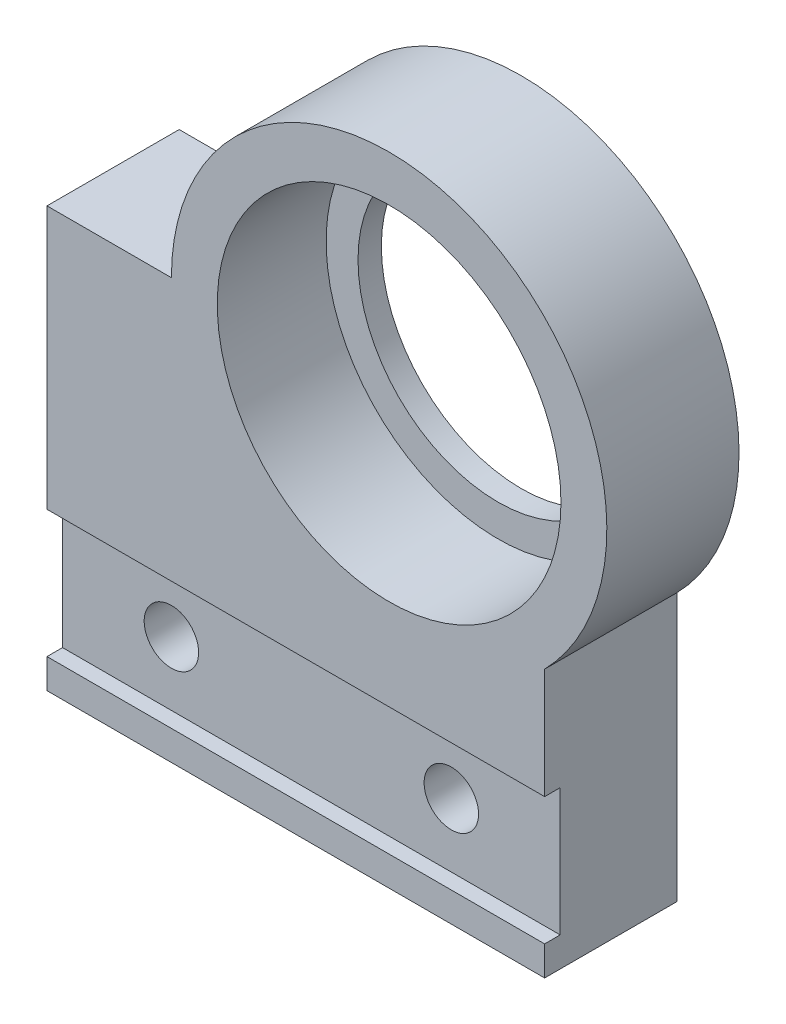
ISO-10303-21;
HEADER;
FILE_DESCRIPTION(('STEP AP214'),'2;1');
FILE_NAME('part.step','',(''),(''),'','','');
FILE_SCHEMA(('AUTOMOTIVE_DESIGN { 1 0 10303 214 1 1 1 1 }'));
ENDSEC;
DATA;
#1=APPLICATION_CONTEXT('core data for automotive mechanical design processes');
#2=APPLICATION_PROTOCOL_DEFINITION('international standard','automotive_design',2000,#1);
#3=PRODUCT_CONTEXT('',#1,'mechanical');
#4=PRODUCT('Part','Part','',(#3));
#5=PRODUCT_RELATED_PRODUCT_CATEGORY('part','',(#4));
#6=PRODUCT_DEFINITION_FORMATION('','',#4);
#7=PRODUCT_DEFINITION_CONTEXT('part definition',#1,'design');
#8=PRODUCT_DEFINITION('design','',#6,#7);
#9=PRODUCT_DEFINITION_SHAPE('','',#8);
#10=(LENGTH_UNIT() NAMED_UNIT(*) SI_UNIT(.MILLI.,.METRE.));
#11=(NAMED_UNIT(*) PLANE_ANGLE_UNIT() SI_UNIT($,.RADIAN.));
#12=(NAMED_UNIT(*) SI_UNIT($,.STERADIAN.) SOLID_ANGLE_UNIT());
#13=UNCERTAINTY_MEASURE_WITH_UNIT(LENGTH_MEASURE(1.E-05),#10,'distance_accuracy_value','');
#14=(GEOMETRIC_REPRESENTATION_CONTEXT(3) GLOBAL_UNCERTAINTY_ASSIGNED_CONTEXT((#13)) GLOBAL_UNIT_ASSIGNED_CONTEXT((#10,
#11,#12)) REPRESENTATION_CONTEXT('',''));
#15=CARTESIAN_POINT('',(0.,0.,0.));
#16=DIRECTION('',(0.,0.,1.));
#17=DIRECTION('',(1.,0.,0.));
#18=AXIS2_PLACEMENT_3D('',#15,#16,#17);
#19=CARTESIAN_POINT('',(250.,0.,-10.8));
#20=DIRECTION('',(0.,0.,1.));
#21=DIRECTION('',(1.,0.,0.));
#22=AXIS2_PLACEMENT_3D('',#19,#20,#21);
#23=PLANE('',#22);
#24=CARTESIAN_POINT('',(250.,0.,-10.8));
#25=DIRECTION('',(0.,0.,1.));
#26=DIRECTION('',(1.,0.,0.));
#27=AXIS2_PLACEMENT_3D('',#24,#25,#26);
#28=CIRCLE('',#27,9.);
#29=CARTESIAN_POINT('',(259.,0.,-10.8));
#30=VERTEX_POINT('',#29);
#31=EDGE_CURVE('E122',#30,#30,#28,.T.);
#32=ORIENTED_EDGE('',*,*,#31,.F.);
#33=EDGE_LOOP('',(#32));
#34=FACE_BOUND('',#33,.T.);
#35=CARTESIAN_POINT('',(250.,0.,-10.8));
#36=DIRECTION('',(0.,0.,1.));
#37=DIRECTION('',(1.,0.,0.));
#38=AXIS2_PLACEMENT_3D('',#35,#36,#37);
#39=CIRCLE('',#38,11.05);
#40=CARTESIAN_POINT('',(261.05,0.,-10.8));
#41=VERTEX_POINT('',#40);
#42=EDGE_CURVE('E35',#41,#41,#39,.T.);
#43=ORIENTED_EDGE('',*,*,#42,.T.);
#44=EDGE_LOOP('',(#43));
#45=FACE_BOUND('',#44,.T.);
#46=ADVANCED_FACE('F15',(#34,#45),#23,.T.);
#47=CARTESIAN_POINT('',(227.9,-25.1,-4.8));
#48=DIRECTION('',(0.,0.,1.));
#49=DIRECTION('',(1.,0.,0.));
#50=AXIS2_PLACEMENT_3D('',#47,#48,#49);
#51=PLANE('',#50);
#52=CARTESIAN_POINT('',(253.,-21.,-4.8));
#53=DIRECTION('',(0.,0.,1.));
#54=DIRECTION('',(1.,0.,0.));
#55=AXIS2_PLACEMENT_3D('',#52,#53,#54);
#56=CIRCLE('',#55,1.75);
#57=CARTESIAN_POINT('',(254.75,-21.,-4.8));
#58=VERTEX_POINT('',#57);
#59=EDGE_CURVE('E109',#58,#58,#56,.T.);
#60=ORIENTED_EDGE('',*,*,#59,.F.);
#61=EDGE_LOOP('',(#60));
#62=FACE_BOUND('',#61,.T.);
#63=CARTESIAN_POINT('',(235.,-21.,-4.8));
#64=DIRECTION('',(0.,0.,1.));
#65=DIRECTION('',(1.,0.,0.));
#66=AXIS2_PLACEMENT_3D('',#63,#64,#65);
#67=CIRCLE('',#66,1.75);
#68=CARTESIAN_POINT('',(236.75,-21.,-4.8));
#69=VERTEX_POINT('',#68);
#70=EDGE_CURVE('E124',#69,#69,#67,.T.);
#71=ORIENTED_EDGE('',*,*,#70,.F.);
#72=EDGE_LOOP('',(#71));
#73=FACE_BOUND('',#72,.T.);
#74=DIRECTION('',(1.,0.,0.));
#75=VECTOR('',#74,1.);
#76=CARTESIAN_POINT('',(227.9,-16.9,-4.8));
#77=LINE('',#76,#75);
#78=CARTESIAN_POINT('',(228.,-16.9,-4.8));
#79=VERTEX_POINT('',#78);
#80=CARTESIAN_POINT('',(260.,-16.9,-4.8));
#81=VERTEX_POINT('',#80);
#82=EDGE_CURVE('E130',#79,#81,#77,.T.);
#83=ORIENTED_EDGE('',*,*,#82,.F.);
#84=DIRECTION('',(0.,-1.,0.));
#85=VECTOR('',#84,1.);
#86=CARTESIAN_POINT('',(228.,-26.05,-4.8));
#87=LINE('',#86,#85);
#88=CARTESIAN_POINT('',(228.,-25.1,-4.8));
#89=VERTEX_POINT('',#88);
#90=EDGE_CURVE('E154',#79,#89,#87,.T.);
#91=ORIENTED_EDGE('',*,*,#90,.T.);
#92=DIRECTION('',(1.,0.,0.));
#93=VECTOR('',#92,1.);
#94=CARTESIAN_POINT('',(227.9,-25.1,-4.8));
#95=LINE('',#94,#93);
#96=CARTESIAN_POINT('',(260.,-25.1,-4.8));
#97=VERTEX_POINT('',#96);
#98=EDGE_CURVE('E10',#89,#97,#95,.T.);
#99=ORIENTED_EDGE('',*,*,#98,.T.);
#100=DIRECTION('',(0.,-1.,0.));
#101=VECTOR('',#100,1.);
#102=CARTESIAN_POINT('',(260.,-26.05,-4.8));
#103=LINE('',#102,#101);
#104=EDGE_CURVE('E174',#81,#97,#103,.T.);
#105=ORIENTED_EDGE('',*,*,#104,.F.);
#106=EDGE_LOOP('',(#83,#91,#99,#105));
#107=FACE_BOUND('',#106,.T.);
#108=ADVANCED_FACE('F313',(#62,#73,#107),#51,.T.);
#109=CARTESIAN_POINT('',(227.9,-25.1,-4.8));
#110=DIRECTION('',(0.,1.,0.));
#111=DIRECTION('',(1.,0.,0.));
#112=AXIS2_PLACEMENT_3D('',#109,#110,#111);
#113=PLANE('',#112);
#114=ORIENTED_EDGE('',*,*,#98,.F.);
#115=DIRECTION('',(0.,0.,1.));
#116=VECTOR('',#115,1.);
#117=CARTESIAN_POINT('',(228.,-25.1,-8.55));
#118=LINE('',#117,#116);
#119=CARTESIAN_POINT('',(228.,-25.1,-3.8));
#120=VERTEX_POINT('',#119);
#121=EDGE_CURVE('E157',#89,#120,#118,.T.);
#122=ORIENTED_EDGE('',*,*,#121,.T.);
#123=DIRECTION('',(-1.,0.,0.));
#124=VECTOR('',#123,1.);
#125=CARTESIAN_POINT('',(238.95,-25.1,-3.8));
#126=LINE('',#125,#124);
#127=CARTESIAN_POINT('',(260.,-25.1,-3.8));
#128=VERTEX_POINT('',#127);
#129=EDGE_CURVE('E25',#128,#120,#126,.T.);
#130=ORIENTED_EDGE('',*,*,#129,.F.);
#131=DIRECTION('',(0.,0.,1.));
#132=VECTOR('',#131,1.);
#133=CARTESIAN_POINT('',(260.,-25.1,-8.55));
#134=LINE('',#133,#132);
#135=EDGE_CURVE('E170',#97,#128,#134,.T.);
#136=ORIENTED_EDGE('',*,*,#135,.F.);
#137=EDGE_LOOP('',(#114,#122,#130,#136));
#138=FACE_BOUND('',#137,.T.);
#139=ADVANCED_FACE('F17',(#138),#113,.T.);
#140=CARTESIAN_POINT('',(250.,0.,-3.8));
#141=DIRECTION('',(0.,0.,1.));
#142=DIRECTION('',(1.,0.,0.));
#143=AXIS2_PLACEMENT_3D('',#140,#141,#142);
#144=PLANE('',#143);
#145=DIRECTION('',(0.,1.,0.));
#146=VECTOR('',#145,1.);
#147=CARTESIAN_POINT('',(260.,-27.,-3.8));
#148=LINE('',#147,#146);
#149=CARTESIAN_POINT('',(260.,-27.,-3.8));
#150=VERTEX_POINT('',#149);
#151=EDGE_CURVE('E185',#150,#128,#148,.T.);
#152=ORIENTED_EDGE('',*,*,#151,.T.);
#153=ORIENTED_EDGE('',*,*,#129,.T.);
#154=DIRECTION('',(0.,1.,0.));
#155=VECTOR('',#154,1.);
#156=CARTESIAN_POINT('',(228.,-27.,-3.8));
#157=LINE('',#156,#155);
#158=CARTESIAN_POINT('',(228.,-27.,-3.8));
#159=VERTEX_POINT('',#158);
#160=EDGE_CURVE('E147',#159,#120,#157,.T.);
#161=ORIENTED_EDGE('',*,*,#160,.F.);
#162=DIRECTION('',(1.,0.,0.));
#163=VECTOR('',#162,1.);
#164=CARTESIAN_POINT('',(228.,-27.,-3.8));
#165=LINE('',#164,#163);
#166=EDGE_CURVE('E166',#159,#150,#165,.T.);
#167=ORIENTED_EDGE('',*,*,#166,.T.);
#168=EDGE_LOOP('',(#152,#153,#161,#167));
#169=FACE_BOUND('',#168,.T.);
#170=ADVANCED_FACE('F317',(#169),#144,.T.);
#171=CARTESIAN_POINT('',(250.,0.,-10.8));
#172=DIRECTION('',(0.,0.,1.));
#173=DIRECTION('',(1.,0.,0.));
#174=AXIS2_PLACEMENT_3D('',#171,#172,#173);
#175=CYLINDRICAL_SURFACE('',#174,11.05);
#176=DIRECTION('',(0.,0.,1.));
#177=VECTOR('',#176,1.);
#178=CARTESIAN_POINT('',(261.05,0.,-10.8));
#179=LINE('',#178,#177);
#180=CARTESIAN_POINT('',(261.05,0.,-3.8));
#181=VERTEX_POINT('',#180);
#182=EDGE_CURVE('E132',#41,#181,#179,.T.);
#183=ORIENTED_EDGE('',*,*,#182,.F.);
#184=ORIENTED_EDGE('',*,*,#42,.F.);
#185=ORIENTED_EDGE('',*,*,#182,.T.);
#186=CARTESIAN_POINT('',(250.,0.,-3.8));
#187=DIRECTION('',(0.,0.,1.));
#188=DIRECTION('',(1.,0.,0.));
#189=AXIS2_PLACEMENT_3D('',#186,#187,#188);
#190=CIRCLE('',#189,11.05);
#191=EDGE_CURVE('E189',#181,#181,#190,.T.);
#192=ORIENTED_EDGE('',*,*,#191,.T.);
#193=EDGE_LOOP('',(#183,#184,#185,#192));
#194=FACE_BOUND('',#193,.T.);
#195=ADVANCED_FACE('F345',(#194),#175,.F.);
#196=CARTESIAN_POINT('',(227.9,-16.9,-4.8));
#197=DIRECTION('',(0.,1.,0.));
#198=DIRECTION('',(1.,0.,0.));
#199=AXIS2_PLACEMENT_3D('',#196,#197,#198);
#200=PLANE('',#199);
#201=DIRECTION('',(0.,0.,1.));
#202=VECTOR('',#201,1.);
#203=CARTESIAN_POINT('',(260.,-16.9,-8.55));
#204=LINE('',#203,#202);
#205=CARTESIAN_POINT('',(260.,-16.9,-3.8));
#206=VERTEX_POINT('',#205);
#207=EDGE_CURVE('E178',#81,#206,#204,.T.);
#208=ORIENTED_EDGE('',*,*,#207,.T.);
#209=DIRECTION('',(-1.,0.,0.));
#210=VECTOR('',#209,1.);
#211=CARTESIAN_POINT('',(238.95,-16.9,-3.8));
#212=LINE('',#211,#210);
#213=CARTESIAN_POINT('',(228.,-16.9,-3.8));
#214=VERTEX_POINT('',#213);
#215=EDGE_CURVE('E196',#206,#214,#212,.T.);
#216=ORIENTED_EDGE('',*,*,#215,.T.);
#217=DIRECTION('',(0.,0.,1.));
#218=VECTOR('',#217,1.);
#219=CARTESIAN_POINT('',(228.,-16.9,-8.55));
#220=LINE('',#219,#218);
#221=EDGE_CURVE('E151',#79,#214,#220,.T.);
#222=ORIENTED_EDGE('',*,*,#221,.F.);
#223=ORIENTED_EDGE('',*,*,#82,.T.);
#224=EDGE_LOOP('',(#208,#216,#222,#223));
#225=FACE_BOUND('',#224,.T.);
#226=ADVANCED_FACE('F309',(#225),#200,.F.);
#227=CARTESIAN_POINT('',(250.,0.,-13.3));
#228=DIRECTION('',(0.,0.,1.));
#229=DIRECTION('',(1.,0.,0.));
#230=AXIS2_PLACEMENT_3D('',#227,#228,#229);
#231=CYLINDRICAL_SURFACE('',#230,9.);
#232=DIRECTION('',(0.,0.,1.));
#233=VECTOR('',#232,1.);
#234=CARTESIAN_POINT('',(259.,0.,-13.3));
#235=LINE('',#234,#233);
#236=CARTESIAN_POINT('',(259.,0.,-12.3));
#237=VERTEX_POINT('',#236);
#238=EDGE_CURVE('E116',#237,#30,#235,.T.);
#239=ORIENTED_EDGE('',*,*,#238,.F.);
#240=CARTESIAN_POINT('',(250.,0.,-12.3));
#241=DIRECTION('',(0.,0.,1.));
#242=DIRECTION('',(1.,0.,0.));
#243=AXIS2_PLACEMENT_3D('',#240,#241,#242);
#244=CIRCLE('',#243,9.);
#245=EDGE_CURVE('E198',#237,#237,#244,.T.);
#246=ORIENTED_EDGE('',*,*,#245,.F.);
#247=ORIENTED_EDGE('',*,*,#238,.T.);
#248=ORIENTED_EDGE('',*,*,#31,.T.);
#249=EDGE_LOOP('',(#239,#246,#247,#248));
#250=FACE_BOUND('',#249,.T.);
#251=ADVANCED_FACE('F332',(#250),#231,.F.);
#252=CARTESIAN_POINT('',(253.,-21.,-13.3));
#253=DIRECTION('',(0.,0.,1.));
#254=DIRECTION('',(1.,0.,0.));
#255=AXIS2_PLACEMENT_3D('',#252,#253,#254);
#256=CYLINDRICAL_SURFACE('',#255,1.75);
#257=DIRECTION('',(0.,0.,1.));
#258=VECTOR('',#257,1.);
#259=CARTESIAN_POINT('',(254.75,-21.,-13.3));
#260=LINE('',#259,#258);
#261=CARTESIAN_POINT('',(254.75,-21.,-12.3));
#262=VERTEX_POINT('',#261);
#263=EDGE_CURVE('E112',#262,#58,#260,.T.);
#264=ORIENTED_EDGE('',*,*,#263,.F.);
#265=CARTESIAN_POINT('',(253.,-21.,-12.3));
#266=DIRECTION('',(0.,0.,1.));
#267=DIRECTION('',(1.,0.,0.));
#268=AXIS2_PLACEMENT_3D('',#265,#266,#267);
#269=CIRCLE('',#268,1.75);
#270=EDGE_CURVE('E203',#262,#262,#269,.T.);
#271=ORIENTED_EDGE('',*,*,#270,.F.);
#272=ORIENTED_EDGE('',*,*,#263,.T.);
#273=ORIENTED_EDGE('',*,*,#59,.T.);
#274=EDGE_LOOP('',(#264,#271,#272,#273));
#275=FACE_BOUND('',#274,.T.);
#276=ADVANCED_FACE('F110',(#275),#256,.F.);
#277=CARTESIAN_POINT('',(235.,-21.,-13.3));
#278=DIRECTION('',(0.,0.,1.));
#279=DIRECTION('',(1.,0.,0.));
#280=AXIS2_PLACEMENT_3D('',#277,#278,#279);
#281=CYLINDRICAL_SURFACE('',#280,1.75);
#282=DIRECTION('',(0.,0.,1.));
#283=VECTOR('',#282,1.);
#284=CARTESIAN_POINT('',(236.75,-21.,-13.3));
#285=LINE('',#284,#283);
#286=CARTESIAN_POINT('',(236.75,-21.,-12.3));
#287=VERTEX_POINT('',#286);
#288=EDGE_CURVE('E144',#287,#69,#285,.T.);
#289=ORIENTED_EDGE('',*,*,#288,.F.);
#290=CARTESIAN_POINT('',(235.,-21.,-12.3));
#291=DIRECTION('',(0.,0.,1.));
#292=DIRECTION('',(1.,0.,0.));
#293=AXIS2_PLACEMENT_3D('',#290,#291,#292);
#294=CIRCLE('',#293,1.75);
#295=EDGE_CURVE('E204',#287,#287,#294,.T.);
#296=ORIENTED_EDGE('',*,*,#295,.F.);
#297=ORIENTED_EDGE('',*,*,#288,.T.);
#298=ORIENTED_EDGE('',*,*,#70,.T.);
#299=EDGE_LOOP('',(#289,#296,#297,#298));
#300=FACE_BOUND('',#299,.T.);
#301=ADVANCED_FACE('F357',(#300),#281,.F.);
#302=CARTESIAN_POINT('',(228.,-27.,-12.3));
#303=DIRECTION('',(1.,0.,0.));
#304=DIRECTION('',(0.,1.,0.));
#305=AXIS2_PLACEMENT_3D('',#302,#303,#304);
#306=PLANE('',#305);
#307=ORIENTED_EDGE('',*,*,#121,.F.);
#308=ORIENTED_EDGE('',*,*,#90,.F.);
#309=ORIENTED_EDGE('',*,*,#221,.T.);
#310=DIRECTION('',(0.,1.,0.));
#311=VECTOR('',#310,1.);
#312=CARTESIAN_POINT('',(228.,-27.,-3.8));
#313=LINE('',#312,#311);
#314=CARTESIAN_POINT('',(228.,0.,-3.8));
#315=VERTEX_POINT('',#314);
#316=EDGE_CURVE('E193',#214,#315,#313,.T.);
#317=ORIENTED_EDGE('',*,*,#316,.T.);
#318=DIRECTION('',(0.,0.,1.));
#319=VECTOR('',#318,1.);
#320=CARTESIAN_POINT('',(228.,0.,-12.3));
#321=LINE('',#320,#319);
#322=CARTESIAN_POINT('',(228.,0.,-12.3));
#323=VERTEX_POINT('',#322);
#324=EDGE_CURVE('E202',#323,#315,#321,.T.);
#325=ORIENTED_EDGE('',*,*,#324,.F.);
#326=DIRECTION('',(0.,1.,0.));
#327=VECTOR('',#326,1.);
#328=CARTESIAN_POINT('',(228.,-27.,-12.3));
#329=LINE('',#328,#327);
#330=CARTESIAN_POINT('',(228.,-27.,-12.3));
#331=VERTEX_POINT('',#330);
#332=EDGE_CURVE('E212',#331,#323,#329,.T.);
#333=ORIENTED_EDGE('',*,*,#332,.F.);
#334=DIRECTION('',(0.,0.,1.));
#335=VECTOR('',#334,1.);
#336=CARTESIAN_POINT('',(228.,-27.,-12.3));
#337=LINE('',#336,#335);
#338=EDGE_CURVE('E162',#331,#159,#337,.T.);
#339=ORIENTED_EDGE('',*,*,#338,.T.);
#340=ORIENTED_EDGE('',*,*,#160,.T.);
#341=EDGE_LOOP('',(#307,#308,#309,#317,#325,#333,#339,#340));
#342=FACE_BOUND('',#341,.T.);
#343=ADVANCED_FACE('F296',(#342),#306,.F.);
#344=CARTESIAN_POINT('',(228.,-27.,-12.3));
#345=DIRECTION('',(0.,1.,0.));
#346=DIRECTION('',(1.,0.,0.));
#347=AXIS2_PLACEMENT_3D('',#344,#345,#346);
#348=PLANE('',#347);
#349=DIRECTION('',(0.,0.,1.));
#350=VECTOR('',#349,1.);
#351=CARTESIAN_POINT('',(260.,-27.,-12.3));
#352=LINE('',#351,#350);
#353=CARTESIAN_POINT('',(260.,-27.,-12.3));
#354=VERTEX_POINT('',#353);
#355=EDGE_CURVE('E181',#354,#150,#352,.T.);
#356=ORIENTED_EDGE('',*,*,#355,.T.);
#357=ORIENTED_EDGE('',*,*,#166,.F.);
#358=ORIENTED_EDGE('',*,*,#338,.F.);
#359=DIRECTION('',(1.,0.,0.));
#360=VECTOR('',#359,1.);
#361=CARTESIAN_POINT('',(228.,-27.,-12.3));
#362=LINE('',#361,#360);
#363=EDGE_CURVE('E221',#331,#354,#362,.T.);
#364=ORIENTED_EDGE('',*,*,#363,.T.);
#365=EDGE_LOOP('',(#356,#357,#358,#364));
#366=FACE_BOUND('',#365,.T.);
#367=ADVANCED_FACE('F292',(#366),#348,.F.);
#368=CARTESIAN_POINT('',(260.,-27.,-12.3));
#369=DIRECTION('',(1.,0.,0.));
#370=DIRECTION('',(0.,1.,0.));
#371=AXIS2_PLACEMENT_3D('',#368,#369,#370);
#372=PLANE('',#371);
#373=ORIENTED_EDGE('',*,*,#151,.F.);
#374=ORIENTED_EDGE('',*,*,#355,.F.);
#375=DIRECTION('',(0.,1.,0.));
#376=VECTOR('',#375,1.);
#377=CARTESIAN_POINT('',(260.,-27.,-12.3));
#378=LINE('',#377,#376);
#379=CARTESIAN_POINT('',(260.,-9.797958971133,-12.3));
#380=VERTEX_POINT('',#379);
#381=EDGE_CURVE('E227',#354,#380,#378,.T.);
#382=ORIENTED_EDGE('',*,*,#381,.T.);
#383=DIRECTION('',(0.,0.,1.));
#384=VECTOR('',#383,1.);
#385=CARTESIAN_POINT('',(260.,-9.797958971133,-12.3));
#386=LINE('',#385,#384);
#387=CARTESIAN_POINT('',(260.,-9.797958971133,-3.8));
#388=VERTEX_POINT('',#387);
#389=EDGE_CURVE('E234',#380,#388,#386,.T.);
#390=ORIENTED_EDGE('',*,*,#389,.T.);
#391=DIRECTION('',(0.,1.,0.));
#392=VECTOR('',#391,1.);
#393=CARTESIAN_POINT('',(260.,-27.,-3.8));
#394=LINE('',#393,#392);
#395=EDGE_CURVE('E192',#206,#388,#394,.T.);
#396=ORIENTED_EDGE('',*,*,#395,.F.);
#397=ORIENTED_EDGE('',*,*,#207,.F.);
#398=ORIENTED_EDGE('',*,*,#104,.T.);
#399=ORIENTED_EDGE('',*,*,#135,.T.);
#400=EDGE_LOOP('',(#373,#374,#382,#390,#396,#397,#398,#399));
#401=FACE_BOUND('',#400,.T.);
#402=ADVANCED_FACE('F289',(#401),#372,.T.);
#403=CARTESIAN_POINT('',(250.,0.,-3.8));
#404=DIRECTION('',(0.,0.,1.));
#405=DIRECTION('',(1.,0.,0.));
#406=AXIS2_PLACEMENT_3D('',#403,#404,#405);
#407=PLANE('',#406);
#408=ORIENTED_EDGE('',*,*,#191,.F.);
#409=EDGE_LOOP('',(#408));
#410=FACE_BOUND('',#409,.T.);
#411=CARTESIAN_POINT('',(250.,0.,-3.8));
#412=DIRECTION('',(0.,0.,-1.));
#413=DIRECTION('',(-1.,0.,0.));
#414=AXIS2_PLACEMENT_3D('',#411,#412,#413);
#415=CIRCLE('',#414,14.);
#416=CARTESIAN_POINT('',(236.,3.39697319875E-13,-3.8));
#417=VERTEX_POINT('',#416);
#418=EDGE_CURVE('E241',#417,#388,#415,.T.);
#419=ORIENTED_EDGE('',*,*,#418,.F.);
#420=DIRECTION('',(1.,0.,0.));
#421=VECTOR('',#420,1.);
#422=CARTESIAN_POINT('',(228.,0.,-3.8));
#423=LINE('',#422,#421);
#424=EDGE_CURVE('E197',#315,#417,#423,.T.);
#425=ORIENTED_EDGE('',*,*,#424,.F.);
#426=ORIENTED_EDGE('',*,*,#316,.F.);
#427=ORIENTED_EDGE('',*,*,#215,.F.);
#428=ORIENTED_EDGE('',*,*,#395,.T.);
#429=EDGE_LOOP('',(#419,#425,#426,#427,#428));
#430=FACE_BOUND('',#429,.T.);
#431=ADVANCED_FACE('F303',(#410,#430),#407,.T.);
#432=CARTESIAN_POINT('',(228.,0.,-12.3));
#433=DIRECTION('',(0.,1.,0.));
#434=DIRECTION('',(1.,0.,0.));
#435=AXIS2_PLACEMENT_3D('',#432,#433,#434);
#436=PLANE('',#435);
#437=DIRECTION('',(1.,0.,0.));
#438=VECTOR('',#437,1.);
#439=CARTESIAN_POINT('',(228.,0.,-12.3));
#440=LINE('',#439,#438);
#441=CARTESIAN_POINT('',(236.,3.39697319875E-13,-12.3));
#442=VERTEX_POINT('',#441);
#443=EDGE_CURVE('E208',#323,#442,#440,.T.);
#444=ORIENTED_EDGE('',*,*,#443,.F.);
#445=ORIENTED_EDGE('',*,*,#324,.T.);
#446=ORIENTED_EDGE('',*,*,#424,.T.);
#447=DIRECTION('',(0.,0.,1.));
#448=VECTOR('',#447,1.);
#449=CARTESIAN_POINT('',(236.,0.,-12.3));
#450=LINE('',#449,#448);
#451=EDGE_CURVE('E248',#442,#417,#450,.T.);
#452=ORIENTED_EDGE('',*,*,#451,.F.);
#453=EDGE_LOOP('',(#444,#445,#446,#452));
#454=FACE_BOUND('',#453,.T.);
#455=ADVANCED_FACE('F300',(#454),#436,.T.);
#456=CARTESIAN_POINT('',(250.,0.,-12.3));
#457=DIRECTION('',(0.,0.,1.));
#458=DIRECTION('',(1.,0.,0.));
#459=AXIS2_PLACEMENT_3D('',#456,#457,#458);
#460=PLANE('',#459);
#461=ORIENTED_EDGE('',*,*,#245,.T.);
#462=EDGE_LOOP('',(#461));
#463=FACE_BOUND('',#462,.T.);
#464=ORIENTED_EDGE('',*,*,#270,.T.);
#465=EDGE_LOOP('',(#464));
#466=FACE_BOUND('',#465,.T.);
#467=ORIENTED_EDGE('',*,*,#295,.T.);
#468=EDGE_LOOP('',(#467));
#469=FACE_BOUND('',#468,.T.);
#470=ORIENTED_EDGE('',*,*,#381,.F.);
#471=ORIENTED_EDGE('',*,*,#363,.F.);
#472=ORIENTED_EDGE('',*,*,#332,.T.);
#473=ORIENTED_EDGE('',*,*,#443,.T.);
#474=CARTESIAN_POINT('',(250.,0.,-12.3));
#475=DIRECTION('',(0.,0.,1.));
#476=DIRECTION('',(0.714285714285737,-0.699854212223742,0.));
#477=AXIS2_PLACEMENT_3D('',#474,#475,#476);
#478=CIRCLE('',#477,14.);
#479=EDGE_CURVE('E252',#380,#442,#478,.T.);
#480=ORIENTED_EDGE('',*,*,#479,.F.);
#481=EDGE_LOOP('',(#470,#471,#472,#473,#480));
#482=FACE_BOUND('',#481,.T.);
#483=ADVANCED_FACE('F268',(#463,#466,#469,#482),#460,.F.);
#484=CARTESIAN_POINT('',(250.,0.,-12.3));
#485=DIRECTION('',(0.,0.,1.));
#486=DIRECTION('',(1.,0.,0.));
#487=AXIS2_PLACEMENT_3D('',#484,#485,#486);
#488=CYLINDRICAL_SURFACE('',#487,14.);
#489=ORIENTED_EDGE('',*,*,#479,.T.);
#490=ORIENTED_EDGE('',*,*,#451,.T.);
#491=ORIENTED_EDGE('',*,*,#418,.T.);
#492=ORIENTED_EDGE('',*,*,#389,.F.);
#493=EDGE_LOOP('',(#489,#490,#491,#492));
#494=FACE_BOUND('',#493,.T.);
#495=ADVANCED_FACE('F260',(#494),#488,.T.);
#496=CLOSED_SHELL('',(#46,#108,#139,#170,#195,#226,#251,#276,#301,#343,#367,#402,#431,#455,#483,#495));
#497=MANIFOLD_SOLID_BREP('B1',#496);
#498=ADVANCED_BREP_SHAPE_REPRESENTATION('',(#18,#497),#14);
#499=SHAPE_DEFINITION_REPRESENTATION(#9,#498);
ENDSEC;
END-ISO-10303-21;
